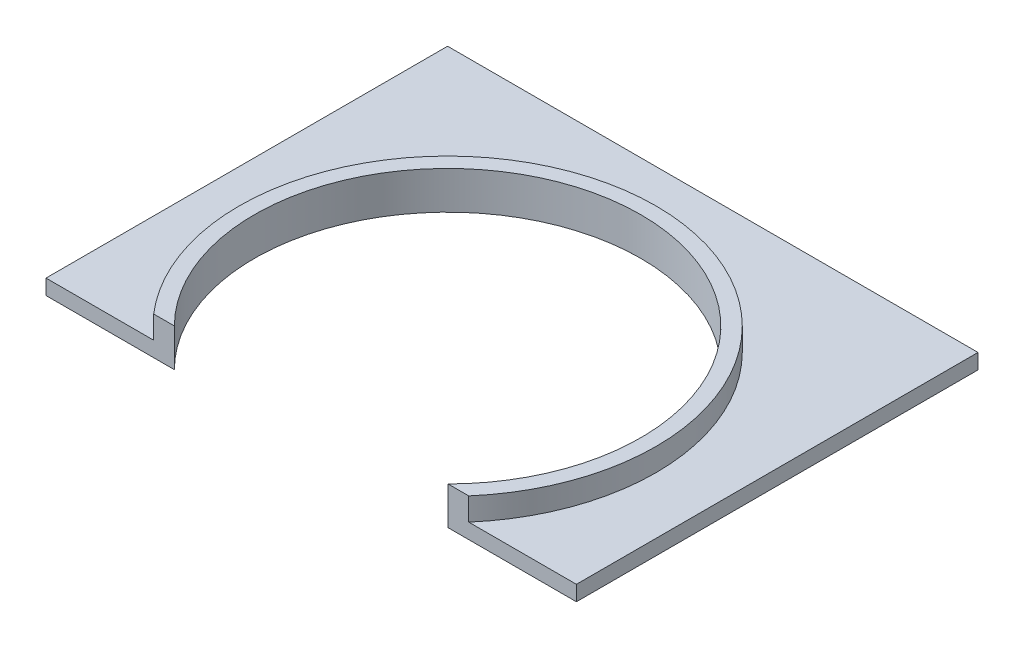
ISO-10303-21;
HEADER;
FILE_DESCRIPTION(('STEP AP214'),'2;1');
FILE_NAME('part.step','',(''),(''),'','','');
FILE_SCHEMA(('AUTOMOTIVE_DESIGN { 1 0 10303 214 1 1 1 1 }'));
ENDSEC;
DATA;
#1=APPLICATION_CONTEXT('core data for automotive mechanical design processes');
#2=APPLICATION_PROTOCOL_DEFINITION('international standard','automotive_design',2000,#1);
#3=PRODUCT_CONTEXT('',#1,'mechanical');
#4=PRODUCT('Part','Part','',(#3));
#5=PRODUCT_RELATED_PRODUCT_CATEGORY('part','',(#4));
#6=PRODUCT_DEFINITION_FORMATION('','',#4);
#7=PRODUCT_DEFINITION_CONTEXT('part definition',#1,'design');
#8=PRODUCT_DEFINITION('design','',#6,#7);
#9=PRODUCT_DEFINITION_SHAPE('','',#8);
#10=(LENGTH_UNIT() NAMED_UNIT(*) SI_UNIT(.MILLI.,.METRE.));
#11=(NAMED_UNIT(*) PLANE_ANGLE_UNIT() SI_UNIT($,.RADIAN.));
#12=(NAMED_UNIT(*) SI_UNIT($,.STERADIAN.) SOLID_ANGLE_UNIT());
#13=UNCERTAINTY_MEASURE_WITH_UNIT(LENGTH_MEASURE(1.E-05),#10,'distance_accuracy_value','');
#14=(GEOMETRIC_REPRESENTATION_CONTEXT(3) GLOBAL_UNCERTAINTY_ASSIGNED_CONTEXT((#13)) GLOBAL_UNIT_ASSIGNED_CONTEXT((#10,
#11,#12)) REPRESENTATION_CONTEXT('',''));
#15=CARTESIAN_POINT('',(0.,0.,0.));
#16=DIRECTION('',(0.,0.,1.));
#17=DIRECTION('',(1.,0.,0.));
#18=AXIS2_PLACEMENT_3D('',#15,#16,#17);
#19=CARTESIAN_POINT('',(0.,2.,0.));
#20=DIRECTION('',(0.,1.,0.));
#21=DIRECTION('',(0.,0.,1.));
#22=AXIS2_PLACEMENT_3D('',#19,#20,#21);
#23=PLANE('',#22);
#24=DIRECTION('',(-1.,0.,0.));
#25=VECTOR('',#24,1.);
#26=CARTESIAN_POINT('',(0.,2.,18.));
#27=LINE('',#26,#25);
#28=CARTESIAN_POINT('',(35.,2.,18.));
#29=VERTEX_POINT('',#28);
#30=CARTESIAN_POINT('',(20.7906228862918,2.,18.));
#31=VERTEX_POINT('',#30);
#32=EDGE_CURVE('E56',#29,#31,#27,.T.);
#33=ORIENTED_EDGE('',*,*,#32,.F.);
#34=DIRECTION('',(0.,0.,-1.));
#35=VECTOR('',#34,1.);
#36=CARTESIAN_POINT('',(35.,2.,-35.));
#37=LINE('',#36,#35);
#38=CARTESIAN_POINT('',(35.,2.,-35.));
#39=VERTEX_POINT('',#38);
#40=EDGE_CURVE('E120',#29,#39,#37,.T.);
#41=ORIENTED_EDGE('',*,*,#40,.T.);
#42=DIRECTION('',(-1.,0.,0.));
#43=VECTOR('',#42,1.);
#44=CARTESIAN_POINT('',(-35.,2.,-35.));
#45=LINE('',#44,#43);
#46=CARTESIAN_POINT('',(-35.,2.,-35.));
#47=VERTEX_POINT('',#46);
#48=EDGE_CURVE('E163',#39,#47,#45,.T.);
#49=ORIENTED_EDGE('',*,*,#48,.T.);
#50=DIRECTION('',(0.,0.,1.));
#51=VECTOR('',#50,1.);
#52=CARTESIAN_POINT('',(-35.,2.,-35.));
#53=LINE('',#52,#51);
#54=CARTESIAN_POINT('',(-35.,2.,18.));
#55=VERTEX_POINT('',#54);
#56=EDGE_CURVE('E134',#47,#55,#53,.T.);
#57=ORIENTED_EDGE('',*,*,#56,.T.);
#58=CARTESIAN_POINT('',(-20.7906228862918,2.,18.));
#59=VERTEX_POINT('',#58);
#60=EDGE_CURVE('E169',#59,#55,#27,.T.);
#61=ORIENTED_EDGE('',*,*,#60,.F.);
#62=CARTESIAN_POINT('',(0.,2.,0.));
#63=DIRECTION('',(0.,1.,0.));
#64=DIRECTION('',(0.,0.,1.));
#65=AXIS2_PLACEMENT_3D('',#62,#63,#64);
#66=CIRCLE('',#65,27.5);
#67=EDGE_CURVE('E149',#31,#59,#66,.T.);
#68=ORIENTED_EDGE('',*,*,#67,.F.);
#69=EDGE_LOOP('',(#33,#41,#49,#57,#61,#68));
#70=FACE_BOUND('',#69,.T.);
#71=ADVANCED_FACE('F41',(#70),#23,.T.);
#72=CARTESIAN_POINT('',(0.,0.,0.));
#73=DIRECTION('',(0.,1.,0.));
#74=DIRECTION('',(0.,0.,1.));
#75=AXIS2_PLACEMENT_3D('',#72,#73,#74);
#76=PLANE('',#75);
#77=DIRECTION('',(0.,0.,-1.));
#78=VECTOR('',#77,1.);
#79=CARTESIAN_POINT('',(35.,0.,-35.));
#80=LINE('',#79,#78);
#81=CARTESIAN_POINT('',(35.,0.,18.));
#82=VERTEX_POINT('',#81);
#83=CARTESIAN_POINT('',(35.,0.,-35.));
#84=VERTEX_POINT('',#83);
#85=EDGE_CURVE('E118',#82,#84,#80,.T.);
#86=ORIENTED_EDGE('',*,*,#85,.F.);
#87=DIRECTION('',(-1.,0.,0.));
#88=VECTOR('',#87,1.);
#89=CARTESIAN_POINT('',(-35.,0.,18.));
#90=LINE('',#89,#88);
#91=CARTESIAN_POINT('',(18.0623918681884,0.,18.));
#92=VERTEX_POINT('',#91);
#93=EDGE_CURVE('E103',#82,#92,#90,.T.);
#94=ORIENTED_EDGE('',*,*,#93,.T.);
#95=CARTESIAN_POINT('',(0.,0.,0.));
#96=DIRECTION('',(0.,1.,0.));
#97=DIRECTION('',(0.,0.,1.));
#98=AXIS2_PLACEMENT_3D('',#95,#96,#97);
#99=CIRCLE('',#98,25.5);
#100=CARTESIAN_POINT('',(-18.0623918681884,0.,18.));
#101=VERTEX_POINT('',#100);
#102=EDGE_CURVE('E127',#92,#101,#99,.T.);
#103=ORIENTED_EDGE('',*,*,#102,.T.);
#104=CARTESIAN_POINT('',(-35.,0.,18.));
#105=VERTEX_POINT('',#104);
#106=EDGE_CURVE('E113',#101,#105,#90,.T.);
#107=ORIENTED_EDGE('',*,*,#106,.T.);
#108=DIRECTION('',(0.,0.,1.));
#109=VECTOR('',#108,1.);
#110=CARTESIAN_POINT('',(-35.,0.,-35.));
#111=LINE('',#110,#109);
#112=CARTESIAN_POINT('',(-35.,0.,-35.));
#113=VERTEX_POINT('',#112);
#114=EDGE_CURVE('E129',#113,#105,#111,.T.);
#115=ORIENTED_EDGE('',*,*,#114,.F.);
#116=DIRECTION('',(-1.,0.,0.));
#117=VECTOR('',#116,1.);
#118=CARTESIAN_POINT('',(-35.,0.,-35.));
#119=LINE('',#118,#117);
#120=EDGE_CURVE('E125',#84,#113,#119,.T.);
#121=ORIENTED_EDGE('',*,*,#120,.F.);
#122=EDGE_LOOP('',(#86,#94,#103,#107,#115,#121));
#123=FACE_BOUND('',#122,.T.);
#124=ADVANCED_FACE('F123',(#123),#76,.F.);
#125=CARTESIAN_POINT('',(35.,2.,-35.));
#126=DIRECTION('',(-1.,0.,0.));
#127=DIRECTION('',(0.,0.,1.));
#128=AXIS2_PLACEMENT_3D('',#125,#126,#127);
#129=PLANE('',#128);
#130=ORIENTED_EDGE('',*,*,#40,.F.);
#131=DIRECTION('',(0.,1.,0.));
#132=VECTOR('',#131,1.);
#133=CARTESIAN_POINT('',(35.,0.,18.));
#134=LINE('',#133,#132);
#135=EDGE_CURVE('E106',#82,#29,#134,.T.);
#136=ORIENTED_EDGE('',*,*,#135,.F.);
#137=ORIENTED_EDGE('',*,*,#85,.T.);
#138=DIRECTION('',(0.,-1.,0.));
#139=VECTOR('',#138,1.);
#140=CARTESIAN_POINT('',(35.,2.,-35.));
#141=LINE('',#140,#139);
#142=EDGE_CURVE('E142',#39,#84,#141,.T.);
#143=ORIENTED_EDGE('',*,*,#142,.F.);
#144=EDGE_LOOP('',(#130,#136,#137,#143));
#145=FACE_BOUND('',#144,.T.);
#146=ADVANCED_FACE('F43',(#145),#129,.F.);
#147=CARTESIAN_POINT('',(-35.,2.,-35.));
#148=DIRECTION('',(0.,0.,1.));
#149=DIRECTION('',(1.,0.,0.));
#150=AXIS2_PLACEMENT_3D('',#147,#148,#149);
#151=PLANE('',#150);
#152=ORIENTED_EDGE('',*,*,#120,.T.);
#153=DIRECTION('',(0.,-1.,0.));
#154=VECTOR('',#153,1.);
#155=CARTESIAN_POINT('',(-35.,2.,-35.));
#156=LINE('',#155,#154);
#157=EDGE_CURVE('E139',#47,#113,#156,.T.);
#158=ORIENTED_EDGE('',*,*,#157,.F.);
#159=ORIENTED_EDGE('',*,*,#48,.F.);
#160=ORIENTED_EDGE('',*,*,#142,.T.);
#161=EDGE_LOOP('',(#152,#158,#159,#160));
#162=FACE_BOUND('',#161,.T.);
#163=ADVANCED_FACE('F183',(#162),#151,.F.);
#164=CARTESIAN_POINT('',(-35.,2.,-35.));
#165=DIRECTION('',(1.,0.,0.));
#166=DIRECTION('',(0.,0.,-1.));
#167=AXIS2_PLACEMENT_3D('',#164,#165,#166);
#168=PLANE('',#167);
#169=ORIENTED_EDGE('',*,*,#114,.T.);
#170=DIRECTION('',(0.,1.,0.));
#171=VECTOR('',#170,1.);
#172=CARTESIAN_POINT('',(-35.,0.,18.));
#173=LINE('',#172,#171);
#174=EDGE_CURVE('E121',#105,#55,#173,.T.);
#175=ORIENTED_EDGE('',*,*,#174,.T.);
#176=ORIENTED_EDGE('',*,*,#56,.F.);
#177=ORIENTED_EDGE('',*,*,#157,.T.);
#178=EDGE_LOOP('',(#169,#175,#176,#177));
#179=FACE_BOUND('',#178,.T.);
#180=ADVANCED_FACE('F172',(#179),#168,.F.);
#181=CARTESIAN_POINT('',(0.,2.,0.));
#182=DIRECTION('',(0.,-1.,0.));
#183=DIRECTION('',(0.,0.,-1.));
#184=AXIS2_PLACEMENT_3D('',#181,#182,#183);
#185=CYLINDRICAL_SURFACE('',#184,25.5);
#186=DIRECTION('',(0.,-1.,0.));
#187=VECTOR('',#186,1.);
#188=CARTESIAN_POINT('',(18.0623918681884,2.,18.));
#189=LINE('',#188,#187);
#190=CARTESIAN_POINT('',(18.0623918681884,5.,18.));
#191=VERTEX_POINT('',#190);
#192=EDGE_CURVE('E108',#191,#92,#189,.T.);
#193=ORIENTED_EDGE('',*,*,#192,.F.);
#194=CARTESIAN_POINT('',(0.,5.,0.));
#195=DIRECTION('',(0.,1.,0.));
#196=DIRECTION('',(0.,0.,1.));
#197=AXIS2_PLACEMENT_3D('',#194,#195,#196);
#198=CIRCLE('',#197,25.5);
#199=CARTESIAN_POINT('',(-18.0623918681884,5.,18.));
#200=VERTEX_POINT('',#199);
#201=EDGE_CURVE('E158',#191,#200,#198,.T.);
#202=ORIENTED_EDGE('',*,*,#201,.T.);
#203=DIRECTION('',(0.,-1.,0.));
#204=VECTOR('',#203,1.);
#205=CARTESIAN_POINT('',(-18.0623918681884,2.,18.));
#206=LINE('',#205,#204);
#207=EDGE_CURVE('E178',#101,#200,#206,.F.);
#208=ORIENTED_EDGE('',*,*,#207,.F.);
#209=ORIENTED_EDGE('',*,*,#102,.F.);
#210=EDGE_LOOP('',(#193,#202,#208,#209));
#211=FACE_BOUND('',#210,.T.);
#212=ADVANCED_FACE('F181',(#211),#185,.F.);
#213=CARTESIAN_POINT('',(0.,5.,0.));
#214=DIRECTION('',(0.,1.,0.));
#215=DIRECTION('',(0.,0.,1.));
#216=AXIS2_PLACEMENT_3D('',#213,#214,#215);
#217=PLANE('',#216);
#218=DIRECTION('',(-1.,0.,0.));
#219=VECTOR('',#218,1.);
#220=CARTESIAN_POINT('',(-35.,5.,18.));
#221=LINE('',#220,#219);
#222=CARTESIAN_POINT('',(20.7906228862918,5.,18.));
#223=VERTEX_POINT('',#222);
#224=EDGE_CURVE('E156',#223,#191,#221,.T.);
#225=ORIENTED_EDGE('',*,*,#224,.F.);
#226=CARTESIAN_POINT('',(0.,5.,0.));
#227=DIRECTION('',(0.,1.,0.));
#228=DIRECTION('',(0.,0.,1.));
#229=AXIS2_PLACEMENT_3D('',#226,#227,#228);
#230=CIRCLE('',#229,27.5);
#231=CARTESIAN_POINT('',(-20.7906228862918,5.,18.));
#232=VERTEX_POINT('',#231);
#233=EDGE_CURVE('E131',#223,#232,#230,.T.);
#234=ORIENTED_EDGE('',*,*,#233,.T.);
#235=EDGE_CURVE('E63',#200,#232,#221,.T.);
#236=ORIENTED_EDGE('',*,*,#235,.F.);
#237=ORIENTED_EDGE('',*,*,#201,.F.);
#238=EDGE_LOOP('',(#225,#234,#236,#237));
#239=FACE_BOUND('',#238,.T.);
#240=ADVANCED_FACE('F153',(#239),#217,.T.);
#241=CARTESIAN_POINT('',(0.,5.,0.));
#242=DIRECTION('',(0.,-1.,0.));
#243=DIRECTION('',(0.,0.,-1.));
#244=AXIS2_PLACEMENT_3D('',#241,#242,#243);
#245=CYLINDRICAL_SURFACE('',#244,27.5);
#246=ORIENTED_EDGE('',*,*,#233,.F.);
#247=DIRECTION('',(0.,-1.,0.));
#248=VECTOR('',#247,1.);
#249=CARTESIAN_POINT('',(20.7906228862918,5.,18.));
#250=LINE('',#249,#248);
#251=EDGE_CURVE('E11',#223,#31,#250,.T.);
#252=ORIENTED_EDGE('',*,*,#251,.T.);
#253=ORIENTED_EDGE('',*,*,#67,.T.);
#254=DIRECTION('',(0.,-1.,0.));
#255=VECTOR('',#254,1.);
#256=CARTESIAN_POINT('',(-20.7906228862918,5.,18.));
#257=LINE('',#256,#255);
#258=EDGE_CURVE('E49',#59,#232,#257,.F.);
#259=ORIENTED_EDGE('',*,*,#258,.T.);
#260=EDGE_LOOP('',(#246,#252,#253,#259));
#261=FACE_BOUND('',#260,.T.);
#262=ADVANCED_FACE('F147',(#261),#245,.T.);
#263=CARTESIAN_POINT('',(-35.,0.,18.));
#264=DIRECTION('',(0.,0.,-1.));
#265=DIRECTION('',(-1.,0.,0.));
#266=AXIS2_PLACEMENT_3D('',#263,#264,#265);
#267=PLANE('',#266);
#268=ORIENTED_EDGE('',*,*,#207,.T.);
#269=ORIENTED_EDGE('',*,*,#235,.T.);
#270=ORIENTED_EDGE('',*,*,#258,.F.);
#271=ORIENTED_EDGE('',*,*,#60,.T.);
#272=ORIENTED_EDGE('',*,*,#174,.F.);
#273=ORIENTED_EDGE('',*,*,#106,.F.);
#274=EDGE_LOOP('',(#268,#269,#270,#271,#272,#273));
#275=FACE_BOUND('',#274,.T.);
#276=ADVANCED_FACE('F201',(#275),#267,.F.);
#277=ORIENTED_EDGE('',*,*,#192,.T.);
#278=ORIENTED_EDGE('',*,*,#93,.F.);
#279=ORIENTED_EDGE('',*,*,#135,.T.);
#280=ORIENTED_EDGE('',*,*,#32,.T.);
#281=ORIENTED_EDGE('',*,*,#251,.F.);
#282=ORIENTED_EDGE('',*,*,#224,.T.);
#283=EDGE_LOOP('',(#277,#278,#279,#280,#281,#282));
#284=FACE_BOUND('',#283,.T.);
#285=ADVANCED_FACE('F105',(#284),#267,.F.);
#286=CLOSED_SHELL('',(#71,#124,#146,#163,#180,#212,#240,#262,#276,#285));
#287=MANIFOLD_SOLID_BREP('B2',#286);
#288=ADVANCED_BREP_SHAPE_REPRESENTATION('',(#18,#287),#14);
#289=SHAPE_DEFINITION_REPRESENTATION(#9,#288);
ENDSEC;
END-ISO-10303-21;
